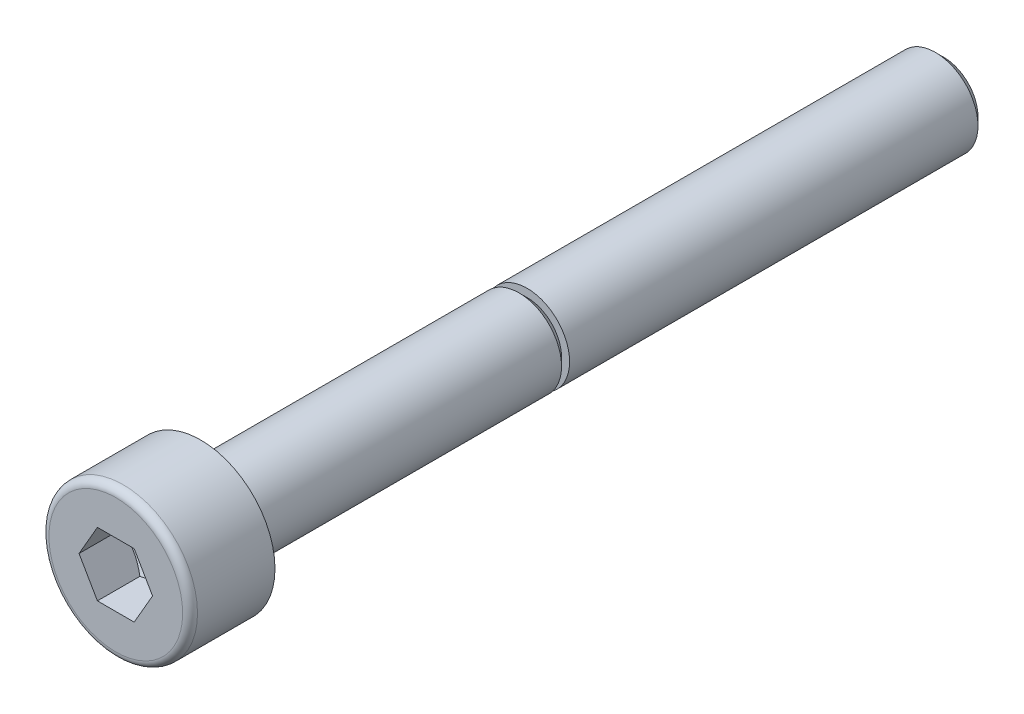
ISO-10303-21;
HEADER;
FILE_DESCRIPTION(('STEP AP214'),'2;1');
FILE_NAME('part.step','',(''),(''),'','','');
FILE_SCHEMA(('AUTOMOTIVE_DESIGN { 1 0 10303 214 1 1 1 1 }'));
ENDSEC;
DATA;
#1=APPLICATION_CONTEXT('core data for automotive mechanical design processes');
#2=APPLICATION_PROTOCOL_DEFINITION('international standard','automotive_design',2000,#1);
#3=PRODUCT_CONTEXT('',#1,'mechanical');
#4=PRODUCT('Part','Part','',(#3));
#5=PRODUCT_RELATED_PRODUCT_CATEGORY('part','',(#4));
#6=PRODUCT_DEFINITION_FORMATION('','',#4);
#7=PRODUCT_DEFINITION_CONTEXT('part definition',#1,'design');
#8=PRODUCT_DEFINITION('design','',#6,#7);
#9=PRODUCT_DEFINITION_SHAPE('','',#8);
#10=(LENGTH_UNIT() NAMED_UNIT(*) SI_UNIT(.MILLI.,.METRE.));
#11=(NAMED_UNIT(*) PLANE_ANGLE_UNIT() SI_UNIT($,.RADIAN.));
#12=(NAMED_UNIT(*) SI_UNIT($,.STERADIAN.) SOLID_ANGLE_UNIT());
#13=UNCERTAINTY_MEASURE_WITH_UNIT(LENGTH_MEASURE(1.E-05),#10,'distance_accuracy_value','');
#14=(GEOMETRIC_REPRESENTATION_CONTEXT(3) GLOBAL_UNCERTAINTY_ASSIGNED_CONTEXT((#13)) GLOBAL_UNIT_ASSIGNED_CONTEXT((#10,
#11,#12)) REPRESENTATION_CONTEXT('',''));
#15=CARTESIAN_POINT('',(0.,0.,0.));
#16=DIRECTION('',(0.,0.,1.));
#17=DIRECTION('',(1.,0.,0.));
#18=AXIS2_PLACEMENT_3D('',#15,#16,#17);
#19=CARTESIAN_POINT('',(0.,0.,4.));
#20=DIRECTION('',(0.,0.,1.));
#21=DIRECTION('',(1.,0.,0.));
#22=AXIS2_PLACEMENT_3D('',#19,#20,#21);
#23=PLANE('',#22);
#24=CARTESIAN_POINT('',(0.,0.,4.));
#25=DIRECTION('',(0.,0.,1.));
#26=DIRECTION('',(1.,0.,0.));
#27=AXIS2_PLACEMENT_3D('',#24,#25,#26);
#28=CIRCLE('',#27,3.15);
#29=CARTESIAN_POINT('',(3.15,0.,4.));
#30=VERTEX_POINT('',#29);
#31=EDGE_CURVE('E118',#30,#30,#28,.T.);
#32=ORIENTED_EDGE('',*,*,#31,.T.);
#33=EDGE_LOOP('',(#32));
#34=FACE_BOUND('',#33,.T.);
#35=DIRECTION('',(1.,0.,0.));
#36=VECTOR('',#35,1.);
#37=CARTESIAN_POINT('',(-0.866025,1.49999930062484,4.));
#38=LINE('',#37,#36);
#39=CARTESIAN_POINT('',(-0.866025,1.49999930062484,4.));
#40=VERTEX_POINT('',#39);
#41=CARTESIAN_POINT('',(0.866025,1.49999930062484,4.));
#42=VERTEX_POINT('',#41);
#43=EDGE_CURVE('E95',#40,#42,#38,.T.);
#44=ORIENTED_EDGE('',*,*,#43,.T.);
#45=DIRECTION('',(0.5,-0.866025403784438,0.));
#46=VECTOR('',#45,1.);
#47=CARTESIAN_POINT('',(0.866025,1.49999930062484,4.));
#48=LINE('',#47,#46);
#49=CARTESIAN_POINT('',(1.73205,0.,4.));
#50=VERTEX_POINT('',#49);
#51=EDGE_CURVE('E32',#42,#50,#48,.T.);
#52=ORIENTED_EDGE('',*,*,#51,.T.);
#53=DIRECTION('',(-0.5,-0.866025403784439,0.));
#54=VECTOR('',#53,1.);
#55=CARTESIAN_POINT('',(1.73205,0.,4.));
#56=LINE('',#55,#54);
#57=CARTESIAN_POINT('',(0.866025,-1.49999930062484,4.));
#58=VERTEX_POINT('',#57);
#59=EDGE_CURVE('E394',#50,#58,#56,.T.);
#60=ORIENTED_EDGE('',*,*,#59,.T.);
#61=DIRECTION('',(-1.,0.,0.));
#62=VECTOR('',#61,1.);
#63=CARTESIAN_POINT('',(0.866025,-1.49999930062484,4.));
#64=LINE('',#63,#62);
#65=CARTESIAN_POINT('',(-0.866025,-1.49999930062484,4.));
#66=VERTEX_POINT('',#65);
#67=EDGE_CURVE('E398',#58,#66,#64,.T.);
#68=ORIENTED_EDGE('',*,*,#67,.T.);
#69=DIRECTION('',(-0.5,0.866025403784439,0.));
#70=VECTOR('',#69,1.);
#71=CARTESIAN_POINT('',(-0.866025,-1.49999930062484,4.));
#72=LINE('',#71,#70);
#73=CARTESIAN_POINT('',(-1.73205,0.,4.));
#74=VERTEX_POINT('',#73);
#75=EDGE_CURVE('E403',#66,#74,#72,.T.);
#76=ORIENTED_EDGE('',*,*,#75,.T.);
#77=DIRECTION('',(0.5,0.866025403784439,0.));
#78=VECTOR('',#77,1.);
#79=CARTESIAN_POINT('',(-1.73205,0.,4.));
#80=LINE('',#79,#78);
#81=EDGE_CURVE('E104',#74,#40,#80,.T.);
#82=ORIENTED_EDGE('',*,*,#81,.T.);
#83=EDGE_LOOP('',(#44,#52,#60,#68,#76,#82));
#84=FACE_BOUND('',#83,.T.);
#85=ADVANCED_FACE('F16',(#34,#84),#23,.T.);
#86=CARTESIAN_POINT('',(0.,1.621125,-35.));
#87=DIRECTION('',(0.,0.,-1.));
#88=DIRECTION('',(-1.,0.,0.));
#89=AXIS2_PLACEMENT_3D('',#86,#87,#88);
#90=PLANE('',#89);
#91=CARTESIAN_POINT('',(0.,0.,-35.));
#92=DIRECTION('',(0.,0.,1.));
#93=DIRECTION('',(1.,0.,0.));
#94=AXIS2_PLACEMENT_3D('',#91,#92,#93);
#95=CIRCLE('',#94,1.621125);
#96=CARTESIAN_POINT('',(1.621125,0.,-35.));
#97=VERTEX_POINT('',#96);
#98=EDGE_CURVE('E11',#97,#97,#95,.T.);
#99=ORIENTED_EDGE('',*,*,#98,.F.);
#100=EDGE_LOOP('',(#99));
#101=FACE_BOUND('',#100,.T.);
#102=ADVANCED_FACE('F18',(#101),#90,.T.);
#103=CARTESIAN_POINT('',(0.,0.,-34.621125));
#104=DIRECTION('',(0.,0.,1.));
#105=DIRECTION('',(1.,0.,0.));
#106=AXIS2_PLACEMENT_3D('',#103,#104,#105);
#107=CONICAL_SURFACE('',#106,2.,0.785398163397448);
#108=ORIENTED_EDGE('',*,*,#98,.T.);
#109=EDGE_LOOP('',(#108));
#110=FACE_BOUND('',#109,.T.);
#111=CARTESIAN_POINT('',(0.,0.,-34.621125));
#112=DIRECTION('',(0.,0.,1.));
#113=DIRECTION('',(1.,0.,0.));
#114=AXIS2_PLACEMENT_3D('',#111,#112,#113);
#115=CIRCLE('',#114,2.);
#116=CARTESIAN_POINT('',(2.,0.,-34.621125));
#117=VERTEX_POINT('',#116);
#118=EDGE_CURVE('E25',#117,#117,#115,.T.);
#119=ORIENTED_EDGE('',*,*,#118,.F.);
#120=EDGE_LOOP('',(#119));
#121=FACE_BOUND('',#120,.T.);
#122=ADVANCED_FACE('F159',(#110,#121),#107,.T.);
#123=CARTESIAN_POINT('',(0.,0.,4.));
#124=DIRECTION('',(0.,0.,1.));
#125=DIRECTION('',(1.,0.,0.));
#126=AXIS2_PLACEMENT_3D('',#123,#124,#125);
#127=CYLINDRICAL_SURFACE('',#126,2.);
#128=ORIENTED_EDGE('',*,*,#118,.T.);
#129=EDGE_LOOP('',(#128));
#130=FACE_BOUND('',#129,.T.);
#131=CARTESIAN_POINT('',(0.,0.,-15.378875));
#132=DIRECTION('',(0.,0.,1.));
#133=DIRECTION('',(1.,0.,0.));
#134=AXIS2_PLACEMENT_3D('',#131,#132,#133);
#135=CIRCLE('',#134,2.);
#136=CARTESIAN_POINT('',(2.,0.,-15.378875));
#137=VERTEX_POINT('',#136);
#138=EDGE_CURVE('E146',#137,#137,#135,.T.);
#139=ORIENTED_EDGE('',*,*,#138,.F.);
#140=EDGE_LOOP('',(#139));
#141=FACE_BOUND('',#140,.T.);
#142=ADVANCED_FACE('F156',(#130,#141),#127,.T.);
#143=CARTESIAN_POINT('',(0.,1.621125,-15.378875));
#144=DIRECTION('',(0.,0.,1.));
#145=DIRECTION('',(1.,0.,0.));
#146=AXIS2_PLACEMENT_3D('',#143,#144,#145);
#147=PLANE('',#146);
#148=ORIENTED_EDGE('',*,*,#138,.T.);
#149=EDGE_LOOP('',(#148));
#150=FACE_BOUND('',#149,.T.);
#151=CARTESIAN_POINT('',(0.,0.,-15.378875));
#152=DIRECTION('',(0.,0.,1.));
#153=DIRECTION('',(1.,0.,0.));
#154=AXIS2_PLACEMENT_3D('',#151,#152,#153);
#155=CIRCLE('',#154,1.621125);
#156=CARTESIAN_POINT('',(1.621125,0.,-15.378875));
#157=VERTEX_POINT('',#156);
#158=EDGE_CURVE('E142',#157,#157,#155,.T.);
#159=ORIENTED_EDGE('',*,*,#158,.F.);
#160=EDGE_LOOP('',(#159));
#161=FACE_BOUND('',#160,.T.);
#162=ADVANCED_FACE('F167',(#150,#161),#147,.T.);
#163=CARTESIAN_POINT('',(0.,0.,-15.));
#164=DIRECTION('',(0.,0.,1.));
#165=DIRECTION('',(1.,0.,0.));
#166=AXIS2_PLACEMENT_3D('',#163,#164,#165);
#167=CONICAL_SURFACE('',#166,2.,0.785398163397445);
#168=ORIENTED_EDGE('',*,*,#158,.T.);
#169=EDGE_LOOP('',(#168));
#170=FACE_BOUND('',#169,.T.);
#171=CARTESIAN_POINT('',(0.,0.,-15.));
#172=DIRECTION('',(0.,0.,1.));
#173=DIRECTION('',(1.,0.,0.));
#174=AXIS2_PLACEMENT_3D('',#171,#172,#173);
#175=CIRCLE('',#174,2.);
#176=CARTESIAN_POINT('',(2.,0.,-15.));
#177=VERTEX_POINT('',#176);
#178=EDGE_CURVE('E138',#177,#177,#175,.T.);
#179=ORIENTED_EDGE('',*,*,#178,.F.);
#180=EDGE_LOOP('',(#179));
#181=FACE_BOUND('',#180,.T.);
#182=ADVANCED_FACE('F199',(#170,#181),#167,.T.);
#183=CARTESIAN_POINT('',(0.,0.,4.));
#184=DIRECTION('',(0.,0.,1.));
#185=DIRECTION('',(1.,0.,0.));
#186=AXIS2_PLACEMENT_3D('',#183,#184,#185);
#187=CYLINDRICAL_SURFACE('',#186,2.);
#188=ORIENTED_EDGE('',*,*,#178,.T.);
#189=EDGE_LOOP('',(#188));
#190=FACE_BOUND('',#189,.T.);
#191=CARTESIAN_POINT('',(0.,0.,-0.2));
#192=DIRECTION('',(0.,0.,1.));
#193=DIRECTION('',(1.,0.,0.));
#194=AXIS2_PLACEMENT_3D('',#191,#192,#193);
#195=CIRCLE('',#194,2.);
#196=CARTESIAN_POINT('',(2.,0.,-0.2));
#197=VERTEX_POINT('',#196);
#198=EDGE_CURVE('E134',#197,#197,#195,.T.);
#199=ORIENTED_EDGE('',*,*,#198,.F.);
#200=EDGE_LOOP('',(#199));
#201=FACE_BOUND('',#200,.T.);
#202=ADVANCED_FACE('F195',(#190,#201),#187,.T.);
#203=CARTESIAN_POINT('',(0.,0.,-0.2));
#204=DIRECTION('',(0.,0.,1.));
#205=DIRECTION('',(1.,0.,0.));
#206=AXIS2_PLACEMENT_3D('',#203,#204,#205);
#207=TOROIDAL_SURFACE('',#206,2.2,0.2);
#208=ORIENTED_EDGE('',*,*,#198,.T.);
#209=EDGE_LOOP('',(#208));
#210=FACE_BOUND('',#209,.T.);
#211=CARTESIAN_POINT('',(0.,0.,0.));
#212=DIRECTION('',(0.,0.,1.));
#213=DIRECTION('',(1.,0.,0.));
#214=AXIS2_PLACEMENT_3D('',#211,#212,#213);
#215=CIRCLE('',#214,2.2);
#216=CARTESIAN_POINT('',(2.2,0.,0.));
#217=VERTEX_POINT('',#216);
#218=EDGE_CURVE('E130',#217,#217,#215,.T.);
#219=ORIENTED_EDGE('',*,*,#218,.F.);
#220=EDGE_LOOP('',(#219));
#221=FACE_BOUND('',#220,.T.);
#222=ADVANCED_FACE('F191',(#210,#221),#207,.F.);
#223=CARTESIAN_POINT('',(0.,3.5,0.));
#224=DIRECTION('',(0.,0.,-1.));
#225=DIRECTION('',(-1.,0.,0.));
#226=AXIS2_PLACEMENT_3D('',#223,#224,#225);
#227=PLANE('',#226);
#228=ORIENTED_EDGE('',*,*,#218,.T.);
#229=EDGE_LOOP('',(#228));
#230=FACE_BOUND('',#229,.T.);
#231=CARTESIAN_POINT('',(0.,0.,0.));
#232=DIRECTION('',(0.,0.,1.));
#233=DIRECTION('',(1.,0.,0.));
#234=AXIS2_PLACEMENT_3D('',#231,#232,#233);
#235=CIRCLE('',#234,3.5);
#236=CARTESIAN_POINT('',(3.5,0.,0.));
#237=VERTEX_POINT('',#236);
#238=EDGE_CURVE('E126',#237,#237,#235,.T.);
#239=ORIENTED_EDGE('',*,*,#238,.F.);
#240=EDGE_LOOP('',(#239));
#241=FACE_BOUND('',#240,.T.);
#242=ADVANCED_FACE('F187',(#230,#241),#227,.T.);
#243=CARTESIAN_POINT('',(0.,0.,4.));
#244=DIRECTION('',(0.,0.,1.));
#245=DIRECTION('',(1.,0.,0.));
#246=AXIS2_PLACEMENT_3D('',#243,#244,#245);
#247=CYLINDRICAL_SURFACE('',#246,3.5);
#248=ORIENTED_EDGE('',*,*,#238,.T.);
#249=EDGE_LOOP('',(#248));
#250=FACE_BOUND('',#249,.T.);
#251=CARTESIAN_POINT('',(0.,0.,3.65));
#252=DIRECTION('',(0.,0.,1.));
#253=DIRECTION('',(1.,0.,0.));
#254=AXIS2_PLACEMENT_3D('',#251,#252,#253);
#255=CIRCLE('',#254,3.5);
#256=CARTESIAN_POINT('',(3.5,0.,3.65));
#257=VERTEX_POINT('',#256);
#258=EDGE_CURVE('E122',#257,#257,#255,.T.);
#259=ORIENTED_EDGE('',*,*,#258,.F.);
#260=EDGE_LOOP('',(#259));
#261=FACE_BOUND('',#260,.T.);
#262=ADVANCED_FACE('F183',(#250,#261),#247,.T.);
#263=CARTESIAN_POINT('',(0.,0.,3.65));
#264=DIRECTION('',(0.,0.,1.));
#265=DIRECTION('',(1.,0.,0.));
#266=AXIS2_PLACEMENT_3D('',#263,#264,#265);
#267=TOROIDAL_SURFACE('',#266,3.15,0.35);
#268=ORIENTED_EDGE('',*,*,#31,.F.);
#269=EDGE_LOOP('',(#268));
#270=FACE_BOUND('',#269,.T.);
#271=ORIENTED_EDGE('',*,*,#258,.T.);
#272=EDGE_LOOP('',(#271));
#273=FACE_BOUND('',#272,.T.);
#274=ADVANCED_FACE('F180',(#270,#273),#267,.T.);
#275=CARTESIAN_POINT('',(0.866025,1.49999930062484,1.00000046625011));
#276=DIRECTION('',(-0.866025403784438,-0.5,0.));
#277=DIRECTION('',(-0.5,0.866025403784438,0.));
#278=AXIS2_PLACEMENT_3D('',#275,#276,#277);
#279=PLANE('',#278);
#280=DIRECTION('',(0.,0.,1.));
#281=VECTOR('',#280,1.);
#282=CARTESIAN_POINT('',(1.73205,0.,1.00000046625011));
#283=LINE('',#282,#281);
#284=CARTESIAN_POINT('',(1.73205,0.,2.));
#285=VERTEX_POINT('',#284);
#286=EDGE_CURVE('E116',#285,#50,#283,.T.);
#287=ORIENTED_EDGE('',*,*,#286,.T.);
#288=ORIENTED_EDGE('',*,*,#51,.F.);
#289=DIRECTION('',(0.,0.,1.));
#290=VECTOR('',#289,1.);
#291=CARTESIAN_POINT('',(0.866025,1.49999930062484,1.00000046625011));
#292=LINE('',#291,#290);
#293=CARTESIAN_POINT('',(0.866025,1.49999930062484,2.));
#294=VERTEX_POINT('',#293);
#295=EDGE_CURVE('E88',#294,#42,#292,.T.);
#296=ORIENTED_EDGE('',*,*,#295,.F.);
#297=CARTESIAN_POINT('',(1.73205115470054,-2.E-06,2.00000066666734));
#298=CARTESIAN_POINT('',(1.69399458130122,0.0659139186895892,1.97802228100261));
#299=CARTESIAN_POINT('',(1.65560950414464,0.132398822577242,1.95803408114054));
#300=CARTESIAN_POINT('',(1.57817473630843,0.266519774741864,1.92314525941874));
#301=CARTESIAN_POINT('',(1.53912367019894,0.334158205333232,1.90825697858766));
#302=CARTESIAN_POINT('',(1.46150547885139,0.468596856338784,1.88508226983918));
#303=CARTESIAN_POINT('',(1.42295029290091,0.535376397300293,1.87664158385231));
#304=CARTESIAN_POINT('',(1.34565859846878,0.669249539059823,1.86656700525616));
#305=CARTESIAN_POINT('',(1.30692237073331,0.736342653591208,1.86492476807133));
#306=CARTESIAN_POINT('',(1.23454773253413,0.861699204131607,1.86834969801067));
#307=CARTESIAN_POINT('',(1.20089846229767,0.919981449818777,1.87257593125167));
#308=CARTESIAN_POINT('',(1.1338191361032,1.03616625092508,1.88596796669928));
#309=CARTESIAN_POINT('',(1.10038931198579,1.09406840478452,1.89513833923059));
#310=CARTESIAN_POINT('',(1.03317179328088,1.21049256234014,1.91806252128818));
#311=CARTESIAN_POINT('',(0.999392601793287,1.26899983823525,1.93191346069662));
#312=CARTESIAN_POINT('',(0.932337893068965,1.38514200063251,1.96334924731355));
#313=CARTESIAN_POINT('',(0.89906151743008,1.4427783739308,1.980926712986));
#314=CARTESIAN_POINT('',(0.866023845299461,1.50000130062484,2.00000066666734));
#315=B_SPLINE_CURVE_WITH_KNOTS('',3,(#297,#298,#299,#300,#301,#302,#303,#304,#305,#306,#307,
#308,#309,#310,#311,#312,#313,#314),.UNSPECIFIED.,.F.,.F.,(4,2,2,2,2,2,2,2,4),(0.,
0.237762055931485,0.476095461361748,0.708530837844131,0.94068083294838,1.14278193102308,
1.34507017093339,1.55184422617205,1.75821246569164),.UNSPECIFIED.);
#316=EDGE_CURVE('E80',#285,#294,#315,.T.);
#317=ORIENTED_EDGE('',*,*,#316,.F.);
#318=EDGE_LOOP('',(#287,#288,#296,#317));
#319=FACE_BOUND('',#318,.T.);
#320=ADVANCED_FACE('F89',(#319),#279,.T.);
#321=CARTESIAN_POINT('',(1.73205,0.,1.00000046625011));
#322=DIRECTION('',(-0.866025403784439,0.5,0.));
#323=DIRECTION('',(0.5,0.866025403784439,0.));
#324=AXIS2_PLACEMENT_3D('',#321,#322,#323);
#325=PLANE('',#324);
#326=DIRECTION('',(0.,0.,1.));
#327=VECTOR('',#326,1.);
#328=CARTESIAN_POINT('',(0.866025,-1.49999930062484,1.00000046625011));
#329=LINE('',#328,#327);
#330=CARTESIAN_POINT('',(0.866025,-1.49999930062484,2.));
#331=VERTEX_POINT('',#330);
#332=EDGE_CURVE('E113',#331,#58,#329,.T.);
#333=ORIENTED_EDGE('',*,*,#332,.T.);
#334=ORIENTED_EDGE('',*,*,#59,.F.);
#335=ORIENTED_EDGE('',*,*,#286,.F.);
#336=CARTESIAN_POINT('',(0.866023845299462,-1.50000130062484,2.00000066666734));
#337=CARTESIAN_POINT('',(0.904080418698778,-1.43408538193525,1.9780222810026));
#338=CARTESIAN_POINT('',(0.942465495855361,-1.36760047804759,1.95803408114054));
#339=CARTESIAN_POINT('',(1.01990026369157,-1.23347952588297,1.92314525941874));
#340=CARTESIAN_POINT('',(1.05895132980106,-1.1658410952916,1.90825697858766));
#341=CARTESIAN_POINT('',(1.13656952114861,-1.03140244428605,1.88508226983918));
#342=CARTESIAN_POINT('',(1.1751247070991,-0.964622903324544,1.87664158385231));
#343=CARTESIAN_POINT('',(1.25241640153122,-0.830749761565014,1.86656700525616));
#344=CARTESIAN_POINT('',(1.29115262926669,-0.763656647033629,1.86492476807133));
#345=CARTESIAN_POINT('',(1.36352726746587,-0.638300096493229,1.86834969801067));
#346=CARTESIAN_POINT('',(1.39717653770233,-0.58001785080606,1.87257593125166));
#347=CARTESIAN_POINT('',(1.4642558638968,-0.463833049699756,1.88596796669928));
#348=CARTESIAN_POINT('',(1.49768568801421,-0.405930895840313,1.89513833923059));
#349=CARTESIAN_POINT('',(1.56490320671912,-0.2895067382847,1.91806252128818));
#350=CARTESIAN_POINT('',(1.59868239820671,-0.230999462389588,1.93191346069662));
#351=CARTESIAN_POINT('',(1.66573710693103,-0.11485729999233,1.96334924731355));
#352=CARTESIAN_POINT('',(1.69901348256992,-0.0572209266940348,1.980926712986));
#353=CARTESIAN_POINT('',(1.73205115470054,1.99999999979098E-06,2.00000066666734));
#354=B_SPLINE_CURVE_WITH_KNOTS('',3,(#336,#337,#338,#339,#340,#341,#342,#343,#344,#345,#346,
#347,#348,#349,#350,#351,#352,#353),.UNSPECIFIED.,.F.,.F.,(4,2,2,2,2,2,2,2,4),(0.,
0.237762055931484,0.476095461361747,0.708530837844129,0.940680832948377,1.14278193102307,
1.34507017093338,1.55184422617205,1.75821246569164),.UNSPECIFIED.);
#355=EDGE_CURVE('E84',#331,#285,#354,.T.);
#356=ORIENTED_EDGE('',*,*,#355,.F.);
#357=EDGE_LOOP('',(#333,#334,#335,#356));
#358=FACE_BOUND('',#357,.T.);
#359=ADVANCED_FACE('F256',(#358),#325,.T.);
#360=CARTESIAN_POINT('',(0.866025,-1.49999930062484,1.00000046625011));
#361=DIRECTION('',(0.,1.,0.));
#362=DIRECTION('',(1.,0.,0.));
#363=AXIS2_PLACEMENT_3D('',#360,#361,#362);
#364=PLANE('',#363);
#365=DIRECTION('',(0.,0.,1.));
#366=VECTOR('',#365,1.);
#367=CARTESIAN_POINT('',(-0.866025,-1.49999930062484,1.00000046625011));
#368=LINE('',#367,#366);
#369=CARTESIAN_POINT('',(-0.866025,-1.49999930062484,2.));
#370=VERTEX_POINT('',#369);
#371=EDGE_CURVE('E110',#370,#66,#368,.T.);
#372=ORIENTED_EDGE('',*,*,#371,.T.);
#373=ORIENTED_EDGE('',*,*,#67,.F.);
#374=ORIENTED_EDGE('',*,*,#332,.F.);
#375=CARTESIAN_POINT('',(-2.24271663728987,-1.49999930062484,2.55775267344395));
#376=CARTESIAN_POINT('',(-2.17794141332338,-1.49999930062484,2.52667596135368));
#377=CARTESIAN_POINT('',(-2.11300852130655,-1.49999930062484,2.49592211621229));
#378=CARTESIAN_POINT('',(-1.98274303131292,-1.49999930062484,2.43524311162405));
#379=CARTESIAN_POINT('',(-1.91741036395219,-1.49999930062484,2.40531810131238));
#380=CARTESIAN_POINT('',(-1.78588635397686,-1.49999930062484,2.34631254095844));
#381=CARTESIAN_POINT('',(-1.71969220663993,-1.49999930062484,2.31723821458641));
#382=CARTESIAN_POINT('',(-1.58674953026847,-1.49999930062484,2.26039396688304));
#383=CARTESIAN_POINT('',(-1.52000103027226,-1.49999930062484,2.23262397772829));
#384=CARTESIAN_POINT('',(-1.38408036083489,-1.49999930062484,2.17802545642731));
#385=CARTESIAN_POINT('',(-1.31489044686774,-1.49999930062484,2.1512405113674));
#386=CARTESIAN_POINT('',(-1.17568875836751,-1.49999930062484,2.09990652822181));
#387=CARTESIAN_POINT('',(-1.10567688208708,-1.49999930062484,2.07535777031023));
#388=CARTESIAN_POINT('',(-0.894522216300188,-1.49999930062484,2.0061010834001));
#389=CARTESIAN_POINT('',(-0.751873977094198,-1.49999930062484,1.9656202744164));
#390=CARTESIAN_POINT('',(-0.535047450977606,-1.49999930062484,1.9186645261203));
#391=CARTESIAN_POINT('',(-0.462365424606466,-1.49999930062484,1.90531291688069));
#392=CARTESIAN_POINT('',(-0.316183762847225,-1.49999930062484,1.8841134767258));
#393=CARTESIAN_POINT('',(-0.242684183051902,-1.49999930062484,1.87626527388084));
#394=CARTESIAN_POINT('',(-0.0961588910059515,-1.49999930062484,1.86679859934064));
#395=CARTESIAN_POINT('',(-0.0231380525234333,-1.49999930062484,1.86510661239957));
#396=CARTESIAN_POINT('',(0.122783022434076,-1.49999930062484,1.86789948707645));
#397=CARTESIAN_POINT('',(0.195683251161583,-1.49999930062484,1.8723847311637));
#398=CARTESIAN_POINT('',(0.375553746438775,-1.49999930062484,1.89067768491976));
#399=CARTESIAN_POINT('',(0.4821754471692,-1.49999930062484,1.90791354190592));
#400=CARTESIAN_POINT('',(0.693345462539466,-1.49999930062484,1.95235984396466));
#401=CARTESIAN_POINT('',(0.79789111749796,-1.49999930062484,1.97958231080908));
#402=CARTESIAN_POINT('',(0.954250638010105,-1.49999930062484,2.02608493590371));
#403=CARTESIAN_POINT('',(1.00687274480645,-1.49999930062484,2.04274751774646));
#404=CARTESIAN_POINT('',(1.11156919647057,-1.49999930062484,2.07761406562061));
#405=CARTESIAN_POINT('',(1.16364386068557,-1.49999930062484,2.09581706970924));
#406=CARTESIAN_POINT('',(1.26731501755411,-1.49999930062484,2.13350010092581));
#407=CARTESIAN_POINT('',(1.31891159517315,-1.49999930062484,2.15297989597396));
#408=CARTESIAN_POINT('',(1.42169818698628,-1.49999930062484,2.19300580386973));
#409=CARTESIAN_POINT('',(1.47288813079445,-1.49999930062484,2.21355209687612));
#410=CARTESIAN_POINT('',(1.6035520536722,-1.49999930062484,2.26731329701247));
#411=CARTESIAN_POINT('',(1.68276476914258,-1.49999930062484,2.30116251352867));
#412=CARTESIAN_POINT('',(1.84047488481565,-1.49999930062484,2.37049266735));
#413=CARTESIAN_POINT('',(1.9189722309026,-1.49999930062484,2.40597372689195));
#414=CARTESIAN_POINT('',(2.15362957255391,-1.49999930062484,2.51428942992019));
#415=CARTESIAN_POINT('',(2.3089286607519,-1.49999930062484,2.58898549353906));
#416=CARTESIAN_POINT('',(2.61820006623532,-1.49999930062484,2.74151036059574));
#417=CARTESIAN_POINT('',(2.77217051778771,-1.49999930062484,2.81934290231597));
#418=CARTESIAN_POINT('',(3.07905650209162,-1.49999930062484,2.97700931547993));
#419=CARTESIAN_POINT('',(3.23197216581148,-1.49999930062484,3.05684293253984));
#420=CARTESIAN_POINT('',(3.52267476728495,-1.49999930062484,3.21028853935711));
#421=CARTESIAN_POINT('',(3.66052737206612,-1.49999930062484,3.28377655462836));
#422=CARTESIAN_POINT('',(3.93578914881928,-1.49999930062484,3.43158990958268));
#423=CARTESIAN_POINT('',(4.07319830413762,-1.49999930062484,3.50591528025237));
#424=CARTESIAN_POINT('',(4.34732590427536,-1.49999930062483,3.65500351537988));
#425=CARTESIAN_POINT('',(4.48404521696312,-1.49999930062483,3.72976478622522));
#426=CARTESIAN_POINT('',(4.75720742747683,-1.49999930062483,3.87977391809883));
#427=CARTESIAN_POINT('',(4.89365033939364,-1.49999930062484,3.9550217534582));
#428=CARTESIAN_POINT('',(5.02999394665514,-1.49999930062484,4.03044801324502));
#429=B_SPLINE_CURVE_WITH_KNOTS('',3,(#375,#376,#377,#378,#379,#380,#381,#382,#383,#384,#385,
#386,#387,#388,#389,#390,#391,#392,#393,#394,#395,#396,#397,#398,#399,#400,#401,#402,#403,#404,
#405,#406,#407,#408,#409,#410,#411,#412,#413,#414,#415,#416,#417,#418,#419,#420,#421,#422,#423,
#424,#425,#426,#427,#428),.UNSPECIFIED.,.F.,.F.,(4,2,2,2,2,2,2,2,2,2,2,2,2,2,2,2,2,2,2,2,2,2,2,
2,2,2,4),(0.,0.215535408976475,0.431109351318747,0.647990972858705,0.864861304394723,
1.08740082372431,1.30996818700982,1.75384735851117,1.97537373294937,2.19688513480997,
2.41574248382684,2.63461338422016,2.95796620171825,3.28170955197757,3.44728283297626,
3.61275347131505,3.77819411534645,3.94366279806486,4.20206179692704,4.46048018336434,
4.97740230798824,5.49495989978084,6.01245202818902,6.48110050133562,6.94976637432356,
7.41724019162004,7.88468954517039),.UNSPECIFIED.);
#430=EDGE_CURVE('E440',#370,#331,#429,.T.);
#431=ORIENTED_EDGE('',*,*,#430,.F.);
#432=EDGE_LOOP('',(#372,#373,#374,#431));
#433=FACE_BOUND('',#432,.T.);
#434=ADVANCED_FACE('F262',(#433),#364,.T.);
#435=CARTESIAN_POINT('',(-0.866025,-1.49999930062484,1.00000046625011));
#436=DIRECTION('',(0.866025403784439,0.5,0.));
#437=DIRECTION('',(0.5,-0.866025403784439,0.));
#438=AXIS2_PLACEMENT_3D('',#435,#436,#437);
#439=PLANE('',#438);
#440=DIRECTION('',(0.,0.,1.));
#441=VECTOR('',#440,1.);
#442=CARTESIAN_POINT('',(-1.73205,0.,1.00000046625011));
#443=LINE('',#442,#441);
#444=CARTESIAN_POINT('',(-1.73205,0.,2.));
#445=VERTEX_POINT('',#444);
#446=EDGE_CURVE('E101',#445,#74,#443,.T.);
#447=ORIENTED_EDGE('',*,*,#446,.T.);
#448=ORIENTED_EDGE('',*,*,#75,.F.);
#449=ORIENTED_EDGE('',*,*,#371,.F.);
#450=CARTESIAN_POINT('',(-1.73205115470054,1.99999999935948E-06,2.00000066666734));
#451=CARTESIAN_POINT('',(-1.69399458130122,-0.0659139186895897,1.97802228100261));
#452=CARTESIAN_POINT('',(-1.65560950414464,-0.132398822577242,1.95803408114054));
#453=CARTESIAN_POINT('',(-1.57817473630843,-0.266519774741865,1.92314525941874));
#454=CARTESIAN_POINT('',(-1.53912367019894,-0.334158205333233,1.90825697858766));
#455=CARTESIAN_POINT('',(-1.46150547885139,-0.468596856338785,1.88508226983918));
#456=CARTESIAN_POINT('',(-1.4229502929009,-0.535376397300293,1.87664158385231));
#457=CARTESIAN_POINT('',(-1.34565859846878,-0.669249539059823,1.86656700525616));
#458=CARTESIAN_POINT('',(-1.30692237073331,-0.736342653591209,1.86492476807133));
#459=CARTESIAN_POINT('',(-1.23454773253413,-0.861699204131608,1.86834969801067));
#460=CARTESIAN_POINT('',(-1.20089846229767,-0.919981449818777,1.87257593125166));
#461=CARTESIAN_POINT('',(-1.1338191361032,-1.03616625092508,1.88596796669928));
#462=CARTESIAN_POINT('',(-1.10038931198579,-1.09406840478452,1.89513833923059));
#463=CARTESIAN_POINT('',(-1.03317179328088,-1.21049256234014,1.91806252128818));
#464=CARTESIAN_POINT('',(-0.999392601793289,-1.26899983823525,1.93191346069662));
#465=CARTESIAN_POINT('',(-0.932337893068967,-1.38514200063251,1.96334924731355));
#466=CARTESIAN_POINT('',(-0.899061517430081,-1.4427783739308,1.980926712986));
#467=CARTESIAN_POINT('',(-0.866023845299461,-1.50000130062484,2.00000066666734));
#468=B_SPLINE_CURVE_WITH_KNOTS('',3,(#450,#451,#452,#453,#454,#455,#456,#457,#458,#459,#460,
#461,#462,#463,#464,#465,#466,#467),.UNSPECIFIED.,.F.,.F.,(4,2,2,2,2,2,2,2,4),(0.,
0.237762055931485,0.476095461361749,0.708530837844132,0.94068083294838,1.14278193102308,
1.34507017093338,1.55184422617205,1.75821246569164),.UNSPECIFIED.);
#469=EDGE_CURVE('E436',#445,#370,#468,.T.);
#470=ORIENTED_EDGE('',*,*,#469,.F.);
#471=EDGE_LOOP('',(#447,#448,#449,#470));
#472=FACE_BOUND('',#471,.T.);
#473=ADVANCED_FACE('F269',(#472),#439,.T.);
#474=CARTESIAN_POINT('',(-1.73205,0.,1.00000046625011));
#475=DIRECTION('',(0.866025403784439,-0.5,0.));
#476=DIRECTION('',(-0.5,-0.866025403784439,0.));
#477=AXIS2_PLACEMENT_3D('',#474,#475,#476);
#478=PLANE('',#477);
#479=DIRECTION('',(0.,0.,1.));
#480=VECTOR('',#479,1.);
#481=CARTESIAN_POINT('',(-0.866025,1.49999930062484,1.00000046625011));
#482=LINE('',#481,#480);
#483=CARTESIAN_POINT('',(-0.866025,1.49999930062484,2.));
#484=VERTEX_POINT('',#483);
#485=EDGE_CURVE('E94',#484,#40,#482,.T.);
#486=ORIENTED_EDGE('',*,*,#485,.T.);
#487=ORIENTED_EDGE('',*,*,#81,.F.);
#488=ORIENTED_EDGE('',*,*,#446,.F.);
#489=CARTESIAN_POINT('',(-0.866023845299462,1.50000130062484,2.00000066666734));
#490=CARTESIAN_POINT('',(-0.904080418698778,1.43408538193525,1.9780222810026));
#491=CARTESIAN_POINT('',(-0.942465495855361,1.36760047804759,1.95803408114054));
#492=CARTESIAN_POINT('',(-1.01990026369157,1.23347952588297,1.92314525941874));
#493=CARTESIAN_POINT('',(-1.05895132980106,1.1658410952916,1.90825697858766));
#494=CARTESIAN_POINT('',(-1.13656952114861,1.03140244428605,1.88508226983918));
#495=CARTESIAN_POINT('',(-1.1751247070991,0.964622903324544,1.87664158385231));
#496=CARTESIAN_POINT('',(-1.25241640153122,0.830749761565014,1.86656700525616));
#497=CARTESIAN_POINT('',(-1.29115262926669,0.763656647033629,1.86492476807133));
#498=CARTESIAN_POINT('',(-1.36352726746587,0.638300096493229,1.86834969801067));
#499=CARTESIAN_POINT('',(-1.39717653770233,0.58001785080606,1.87257593125166));
#500=CARTESIAN_POINT('',(-1.4642558638968,0.463833049699756,1.88596796669928));
#501=CARTESIAN_POINT('',(-1.49768568801421,0.405930895840313,1.89513833923059));
#502=CARTESIAN_POINT('',(-1.56490320671912,0.289506738284699,1.91806252128818));
#503=CARTESIAN_POINT('',(-1.59868239820671,0.230999462389588,1.93191346069662));
#504=CARTESIAN_POINT('',(-1.66573710693103,0.11485729999233,1.96334924731355));
#505=CARTESIAN_POINT('',(-1.69901348256992,0.0572209266940344,1.980926712986));
#506=CARTESIAN_POINT('',(-1.73205115470054,-2.00000000048508E-06,2.00000066666734));
#507=B_SPLINE_CURVE_WITH_KNOTS('',3,(#489,#490,#491,#492,#493,#494,#495,#496,#497,#498,#499,
#500,#501,#502,#503,#504,#505,#506),.UNSPECIFIED.,.F.,.F.,(4,2,2,2,2,2,2,2,4),(0.,
0.237762055931484,0.476095461361747,0.708530837844129,0.940680832948377,1.14278193102307,
1.34507017093338,1.55184422617205,1.75821246569164),.UNSPECIFIED.);
#508=EDGE_CURVE('E40',#484,#445,#507,.T.);
#509=ORIENTED_EDGE('',*,*,#508,.F.);
#510=EDGE_LOOP('',(#486,#487,#488,#509));
#511=FACE_BOUND('',#510,.T.);
#512=ADVANCED_FACE('F277',(#511),#478,.T.);
#513=CARTESIAN_POINT('',(-0.866025,1.49999930062484,1.00000046625011));
#514=DIRECTION('',(0.,-1.,0.));
#515=DIRECTION('',(-1.,0.,0.));
#516=AXIS2_PLACEMENT_3D('',#513,#514,#515);
#517=PLANE('',#516);
#518=ORIENTED_EDGE('',*,*,#295,.T.);
#519=ORIENTED_EDGE('',*,*,#43,.F.);
#520=ORIENTED_EDGE('',*,*,#485,.F.);
#521=CARTESIAN_POINT('',(-2.24271663728987,1.49999930062484,2.55775267344395));
#522=CARTESIAN_POINT('',(-2.17794141332338,1.49999930062484,2.52667596135368));
#523=CARTESIAN_POINT('',(-2.11300852130655,1.49999930062484,2.49592211621229));
#524=CARTESIAN_POINT('',(-1.98274303131292,1.49999930062484,2.43524311162405));
#525=CARTESIAN_POINT('',(-1.91741036395219,1.49999930062484,2.40531810131238));
#526=CARTESIAN_POINT('',(-1.78588635397687,1.49999930062484,2.34631254095844));
#527=CARTESIAN_POINT('',(-1.71969220663993,1.49999930062484,2.31723821458641));
#528=CARTESIAN_POINT('',(-1.58674953026847,1.49999930062484,2.26039396688304));
#529=CARTESIAN_POINT('',(-1.52000103027226,1.49999930062484,2.23262397772829));
#530=CARTESIAN_POINT('',(-1.3840803608349,1.49999930062484,2.17802545642731));
#531=CARTESIAN_POINT('',(-1.31489044686775,1.49999930062484,2.1512405113674));
#532=CARTESIAN_POINT('',(-1.17568875836751,1.49999930062484,2.09990652822181));
#533=CARTESIAN_POINT('',(-1.10567688208708,1.49999930062484,2.07535777031023));
#534=CARTESIAN_POINT('',(-0.894522216300189,1.49999930062484,2.0061010834001));
#535=CARTESIAN_POINT('',(-0.751873977094199,1.49999930062484,1.9656202744164));
#536=CARTESIAN_POINT('',(-0.535047450977607,1.49999930062484,1.9186645261203));
#537=CARTESIAN_POINT('',(-0.462365424606467,1.49999930062484,1.90531291688069));
#538=CARTESIAN_POINT('',(-0.316183762847226,1.49999930062484,1.8841134767258));
#539=CARTESIAN_POINT('',(-0.242684183051903,1.49999930062484,1.87626527388084));
#540=CARTESIAN_POINT('',(-0.0961588910059524,1.49999930062484,1.86679859934064));
#541=CARTESIAN_POINT('',(-0.0231380525234342,1.49999930062484,1.86510661239957));
#542=CARTESIAN_POINT('',(0.122783022434075,1.49999930062484,1.86789948707645));
#543=CARTESIAN_POINT('',(0.195683251161582,1.49999930062484,1.8723847311637));
#544=CARTESIAN_POINT('',(0.375553746438774,1.49999930062484,1.89067768491976));
#545=CARTESIAN_POINT('',(0.482175447169199,1.49999930062484,1.90791354190592));
#546=CARTESIAN_POINT('',(0.693345462539464,1.49999930062484,1.95235984396466));
#547=CARTESIAN_POINT('',(0.797891117497957,1.49999930062484,1.97958231080908));
#548=CARTESIAN_POINT('',(0.954250638010102,1.49999930062484,2.02608493590371));
#549=CARTESIAN_POINT('',(1.00687274480645,1.49999930062484,2.04274751774646));
#550=CARTESIAN_POINT('',(1.11156919647056,1.49999930062484,2.07761406562061));
#551=CARTESIAN_POINT('',(1.16364386068556,1.49999930062484,2.09581706970924));
#552=CARTESIAN_POINT('',(1.2673150175541,1.49999930062484,2.13350010092581));
#553=CARTESIAN_POINT('',(1.31891159517315,1.49999930062484,2.15297989597396));
#554=CARTESIAN_POINT('',(1.42169818698628,1.49999930062484,2.19300580386972));
#555=CARTESIAN_POINT('',(1.47288813079445,1.49999930062484,2.21355209687612));
#556=CARTESIAN_POINT('',(1.60355205367219,1.49999930062484,2.26731329701247));
#557=CARTESIAN_POINT('',(1.68276476914257,1.49999930062484,2.30116251352867));
#558=CARTESIAN_POINT('',(1.84047488481565,1.49999930062484,2.37049266735));
#559=CARTESIAN_POINT('',(1.91897223090259,1.49999930062484,2.40597372689195));
#560=CARTESIAN_POINT('',(2.15362957255391,1.49999930062484,2.51428942992019));
#561=CARTESIAN_POINT('',(2.30892866075189,1.49999930062484,2.58898549353906));
#562=CARTESIAN_POINT('',(2.61820006623532,1.49999930062484,2.74151036059574));
#563=CARTESIAN_POINT('',(2.77217051778771,1.49999930062484,2.81934290231597));
#564=CARTESIAN_POINT('',(3.07905650209162,1.49999930062484,2.97700931547993));
#565=CARTESIAN_POINT('',(3.23197216581148,1.49999930062484,3.05684293253984));
#566=CARTESIAN_POINT('',(3.52267476728495,1.49999930062484,3.21028853935711));
#567=CARTESIAN_POINT('',(3.66052737206611,1.49999930062484,3.28377655462836));
#568=CARTESIAN_POINT('',(3.93578914881928,1.49999930062484,3.43158990958268));
#569=CARTESIAN_POINT('',(4.07319830413762,1.49999930062484,3.50591528025237));
#570=CARTESIAN_POINT('',(4.34732590427536,1.49999930062484,3.65500351537988));
#571=CARTESIAN_POINT('',(4.48404521696312,1.49999930062484,3.72976478622523));
#572=CARTESIAN_POINT('',(4.75720742747683,1.49999930062484,3.87977391809883));
#573=CARTESIAN_POINT('',(4.89365033939364,1.49999930062484,3.9550217534582));
#574=CARTESIAN_POINT('',(5.02999394665514,1.49999930062484,4.03044801324502));
#575=B_SPLINE_CURVE_WITH_KNOTS('',3,(#521,#522,#523,#524,#525,#526,#527,#528,#529,#530,#531,
#532,#533,#534,#535,#536,#537,#538,#539,#540,#541,#542,#543,#544,#545,#546,#547,#548,#549,#550,
#551,#552,#553,#554,#555,#556,#557,#558,#559,#560,#561,#562,#563,#564,#565,#566,#567,#568,#569,
#570,#571,#572,#573,#574),.UNSPECIFIED.,.F.,.F.,(4,2,2,2,2,2,2,2,2,2,2,2,2,2,2,2,2,2,2,2,2,2,2,
2,2,2,4),(0.,0.215535408976474,0.431109351318746,0.647990972858704,0.864861304394721,
1.0874008237243,1.30996818700982,1.75384735851117,1.97537373294937,2.19688513480997,
2.41574248382684,2.63461338422015,2.95796620171825,3.28170955197757,3.44728283297626,
3.61275347131505,3.77819411534645,3.94366279806485,4.20206179692704,4.46048018336433,
4.97740230798824,5.49495989978084,6.01245202818902,6.48110050133561,6.94976637432355,
7.41724019162004,7.88468954517039),.UNSPECIFIED.);
#576=EDGE_CURVE('E81',#294,#484,#575,.F.);
#577=ORIENTED_EDGE('',*,*,#576,.F.);
#578=EDGE_LOOP('',(#518,#519,#520,#577));
#579=FACE_BOUND('',#578,.T.);
#580=ADVANCED_FACE('F76',(#579),#517,.T.);
#581=CARTESIAN_POINT('',(0.,0.,1.00000046625011));
#582=DIRECTION('',(0.,0.,1.));
#583=DIRECTION('',(1.,0.,0.));
#584=AXIS2_PLACEMENT_3D('',#581,#582,#583);
#585=CONICAL_SURFACE('',#584,0.,1.0471975511966);
#586=CARTESIAN_POINT('',(0.,0.,1.00000046625011));
#587=VERTEX_POINT('',#586);
#588=VERTEX_LOOP('',#587);
#589=FACE_BOUND('',#588,.T.);
#590=ORIENTED_EDGE('',*,*,#316,.T.);
#591=ORIENTED_EDGE('',*,*,#576,.T.);
#592=ORIENTED_EDGE('',*,*,#508,.T.);
#593=ORIENTED_EDGE('',*,*,#469,.T.);
#594=ORIENTED_EDGE('',*,*,#430,.T.);
#595=ORIENTED_EDGE('',*,*,#355,.T.);
#596=EDGE_LOOP('',(#590,#591,#592,#593,#594,#595));
#597=FACE_BOUND('',#596,.T.);
#598=ADVANCED_FACE('F73',(#589,#597),#585,.F.);
#599=CLOSED_SHELL('',(#85,#102,#122,#142,#162,#182,#202,#222,#242,#262,#274,#320,#359,#434,#473,
#512,#580,#598));
#600=MANIFOLD_SOLID_BREP('B1',#599);
#601=ADVANCED_BREP_SHAPE_REPRESENTATION('',(#18,#600),#14);
#602=SHAPE_DEFINITION_REPRESENTATION(#9,#601);
ENDSEC;
END-ISO-10303-21;
